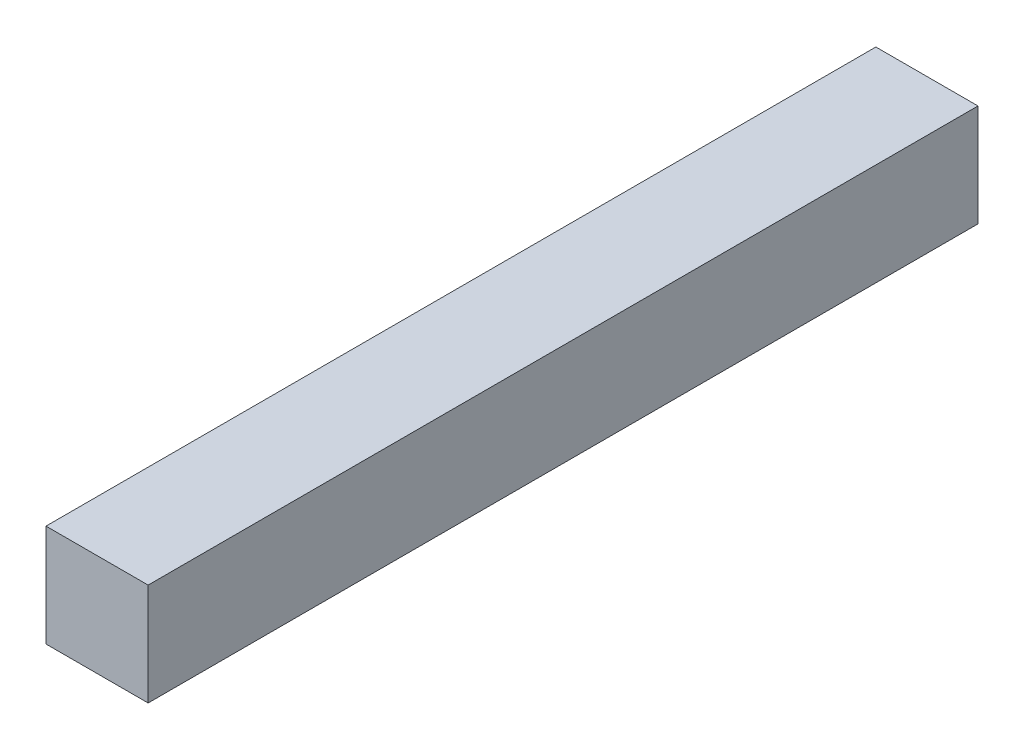
ISO-10303-21;
HEADER;
FILE_DESCRIPTION(('STEP AP214'),'2;1');
FILE_NAME('part.step','',(''),(''),'','','');
FILE_SCHEMA(('AUTOMOTIVE_DESIGN { 1 0 10303 214 1 1 1 1 }'));
ENDSEC;
DATA;
#1=APPLICATION_CONTEXT('core data for automotive mechanical design processes');
#2=APPLICATION_PROTOCOL_DEFINITION('international standard','automotive_design',2000,#1);
#3=PRODUCT_CONTEXT('',#1,'mechanical');
#4=PRODUCT('Part','Part','',(#3));
#5=PRODUCT_RELATED_PRODUCT_CATEGORY('part','',(#4));
#6=PRODUCT_DEFINITION_FORMATION('','',#4);
#7=PRODUCT_DEFINITION_CONTEXT('part definition',#1,'design');
#8=PRODUCT_DEFINITION('design','',#6,#7);
#9=PRODUCT_DEFINITION_SHAPE('','',#8);
#10=(LENGTH_UNIT() NAMED_UNIT(*) SI_UNIT(.MILLI.,.METRE.));
#11=(NAMED_UNIT(*) PLANE_ANGLE_UNIT() SI_UNIT($,.RADIAN.));
#12=(NAMED_UNIT(*) SI_UNIT($,.STERADIAN.) SOLID_ANGLE_UNIT());
#13=UNCERTAINTY_MEASURE_WITH_UNIT(LENGTH_MEASURE(1.E-05),#10,'distance_accuracy_value','');
#14=(GEOMETRIC_REPRESENTATION_CONTEXT(3) GLOBAL_UNCERTAINTY_ASSIGNED_CONTEXT((#13)) GLOBAL_UNIT_ASSIGNED_CONTEXT((#10,
#11,#12)) REPRESENTATION_CONTEXT('',''));
#15=CARTESIAN_POINT('',(0.,0.,0.));
#16=DIRECTION('',(0.,0.,1.));
#17=DIRECTION('',(1.,0.,0.));
#18=AXIS2_PLACEMENT_3D('',#15,#16,#17);
#19=CARTESIAN_POINT('',(0.,0.,17.));
#20=DIRECTION('',(1.,0.,0.));
#21=DIRECTION('',(0.,1.,0.));
#22=AXIS2_PLACEMENT_3D('',#19,#20,#21);
#23=PLANE('',#22);
#24=DIRECTION('',(0.,0.,-1.));
#25=VECTOR('',#24,1.);
#26=CARTESIAN_POINT('',(0.,0.,17.));
#27=LINE('',#26,#25);
#28=CARTESIAN_POINT('',(0.,0.,9.5));
#29=VERTEX_POINT('',#28);
#30=CARTESIAN_POINT('',(0.,0.,3.));
#31=VERTEX_POINT('',#30);
#32=EDGE_CURVE('E11',#29,#31,#27,.T.);
#33=ORIENTED_EDGE('',*,*,#32,.F.);
#34=DIRECTION('',(0.,-1.,0.));
#35=VECTOR('',#34,1.);
#36=CARTESIAN_POINT('',(0.,0.,9.5));
#37=LINE('',#36,#35);
#38=CARTESIAN_POINT('',(0.,0.8,9.5));
#39=VERTEX_POINT('',#38);
#40=EDGE_CURVE('E71',#39,#29,#37,.T.);
#41=ORIENTED_EDGE('',*,*,#40,.F.);
#42=DIRECTION('',(0.,0.,-1.));
#43=VECTOR('',#42,1.);
#44=CARTESIAN_POINT('',(0.,0.8,17.));
#45=LINE('',#44,#43);
#46=CARTESIAN_POINT('',(0.,0.8,3.));
#47=VERTEX_POINT('',#46);
#48=EDGE_CURVE('E55',#39,#47,#45,.T.);
#49=ORIENTED_EDGE('',*,*,#48,.T.);
#50=DIRECTION('',(0.,1.,0.));
#51=VECTOR('',#50,1.);
#52=CARTESIAN_POINT('',(0.,0.,3.));
#53=LINE('',#52,#51);
#54=EDGE_CURVE('E84',#31,#47,#53,.T.);
#55=ORIENTED_EDGE('',*,*,#54,.F.);
#56=EDGE_LOOP('',(#33,#41,#49,#55));
#57=FACE_BOUND('',#56,.T.);
#58=ADVANCED_FACE('F33',(#57),#23,.F.);
#59=CARTESIAN_POINT('',(0.,0.,17.));
#60=DIRECTION('',(0.,1.,0.));
#61=DIRECTION('',(0.,0.,1.));
#62=AXIS2_PLACEMENT_3D('',#59,#60,#61);
#63=PLANE('',#62);
#64=DIRECTION('',(0.,0.,-1.));
#65=VECTOR('',#64,1.);
#66=CARTESIAN_POINT('',(0.8,0.,17.));
#67=LINE('',#66,#65);
#68=CARTESIAN_POINT('',(0.8,0.,9.5));
#69=VERTEX_POINT('',#68);
#70=CARTESIAN_POINT('',(0.8,0.,3.));
#71=VERTEX_POINT('',#70);
#72=EDGE_CURVE('E40',#69,#71,#67,.T.);
#73=ORIENTED_EDGE('',*,*,#72,.F.);
#74=DIRECTION('',(1.,0.,0.));
#75=VECTOR('',#74,1.);
#76=CARTESIAN_POINT('',(0.,0.,9.5));
#77=LINE('',#76,#75);
#78=EDGE_CURVE('E74',#29,#69,#77,.T.);
#79=ORIENTED_EDGE('',*,*,#78,.F.);
#80=ORIENTED_EDGE('',*,*,#32,.T.);
#81=DIRECTION('',(-1.,0.,0.));
#82=VECTOR('',#81,1.);
#83=CARTESIAN_POINT('',(0.,0.,3.));
#84=LINE('',#83,#82);
#85=EDGE_CURVE('E97',#71,#31,#84,.T.);
#86=ORIENTED_EDGE('',*,*,#85,.F.);
#87=EDGE_LOOP('',(#73,#79,#80,#86));
#88=FACE_BOUND('',#87,.T.);
#89=ADVANCED_FACE('F80',(#88),#63,.F.);
#90=CARTESIAN_POINT('',(0.8,0.,17.));
#91=DIRECTION('',(-1.,0.,0.));
#92=DIRECTION('',(0.,0.,1.));
#93=AXIS2_PLACEMENT_3D('',#90,#91,#92);
#94=PLANE('',#93);
#95=DIRECTION('',(0.,0.,-1.));
#96=VECTOR('',#95,1.);
#97=CARTESIAN_POINT('',(0.8,0.8,17.));
#98=LINE('',#97,#96);
#99=CARTESIAN_POINT('',(0.8,0.8,9.5));
#100=VERTEX_POINT('',#99);
#101=CARTESIAN_POINT('',(0.8,0.8,3.));
#102=VERTEX_POINT('',#101);
#103=EDGE_CURVE('E100',#100,#102,#98,.T.);
#104=ORIENTED_EDGE('',*,*,#103,.F.);
#105=DIRECTION('',(0.,1.,0.));
#106=VECTOR('',#105,1.);
#107=CARTESIAN_POINT('',(0.8,0.,9.5));
#108=LINE('',#107,#106);
#109=EDGE_CURVE('E47',#69,#100,#108,.T.);
#110=ORIENTED_EDGE('',*,*,#109,.F.);
#111=ORIENTED_EDGE('',*,*,#72,.T.);
#112=DIRECTION('',(0.,-1.,0.));
#113=VECTOR('',#112,1.);
#114=CARTESIAN_POINT('',(0.8,0.,3.));
#115=LINE('',#114,#113);
#116=EDGE_CURVE('E90',#102,#71,#115,.T.);
#117=ORIENTED_EDGE('',*,*,#116,.F.);
#118=EDGE_LOOP('',(#104,#110,#111,#117));
#119=FACE_BOUND('',#118,.T.);
#120=ADVANCED_FACE('F104',(#119),#94,.F.);
#121=CARTESIAN_POINT('',(0.,0.8,17.));
#122=DIRECTION('',(0.,-1.,0.));
#123=DIRECTION('',(0.,0.,-1.));
#124=AXIS2_PLACEMENT_3D('',#121,#122,#123);
#125=PLANE('',#124);
#126=ORIENTED_EDGE('',*,*,#48,.F.);
#127=DIRECTION('',(-1.,0.,0.));
#128=VECTOR('',#127,1.);
#129=CARTESIAN_POINT('',(0.,0.8,9.5));
#130=LINE('',#129,#128);
#131=EDGE_CURVE('E75',#100,#39,#130,.T.);
#132=ORIENTED_EDGE('',*,*,#131,.F.);
#133=ORIENTED_EDGE('',*,*,#103,.T.);
#134=DIRECTION('',(1.,0.,0.));
#135=VECTOR('',#134,1.);
#136=CARTESIAN_POINT('',(0.,0.8,3.));
#137=LINE('',#136,#135);
#138=EDGE_CURVE('E88',#47,#102,#137,.T.);
#139=ORIENTED_EDGE('',*,*,#138,.F.);
#140=EDGE_LOOP('',(#126,#132,#133,#139));
#141=FACE_BOUND('',#140,.T.);
#142=ADVANCED_FACE('F107',(#141),#125,.F.);
#143=CARTESIAN_POINT('',(0.,0.,3.));
#144=DIRECTION('',(0.,0.,-1.));
#145=DIRECTION('',(-1.,0.,0.));
#146=AXIS2_PLACEMENT_3D('',#143,#144,#145);
#147=PLANE('',#146);
#148=ORIENTED_EDGE('',*,*,#54,.T.);
#149=ORIENTED_EDGE('',*,*,#138,.T.);
#150=ORIENTED_EDGE('',*,*,#116,.T.);
#151=ORIENTED_EDGE('',*,*,#85,.T.);
#152=EDGE_LOOP('',(#148,#149,#150,#151));
#153=FACE_BOUND('',#152,.T.);
#154=ADVANCED_FACE('F105',(#153),#147,.T.);
#155=CARTESIAN_POINT('',(0.,0.,9.5));
#156=DIRECTION('',(0.,0.,-1.));
#157=DIRECTION('',(-1.,0.,0.));
#158=AXIS2_PLACEMENT_3D('',#155,#156,#157);
#159=PLANE('',#158);
#160=ORIENTED_EDGE('',*,*,#40,.T.);
#161=ORIENTED_EDGE('',*,*,#78,.T.);
#162=ORIENTED_EDGE('',*,*,#109,.T.);
#163=ORIENTED_EDGE('',*,*,#131,.T.);
#164=EDGE_LOOP('',(#160,#161,#162,#163));
#165=FACE_BOUND('',#164,.T.);
#166=ADVANCED_FACE('F73',(#165),#159,.F.);
#167=CLOSED_SHELL('',(#58,#89,#120,#142,#154,#166));
#168=MANIFOLD_SOLID_BREP('B2',#167);
#169=ADVANCED_BREP_SHAPE_REPRESENTATION('',(#18,#168),#14);
#170=SHAPE_DEFINITION_REPRESENTATION(#9,#169);
ENDSEC;
END-ISO-10303-21;
